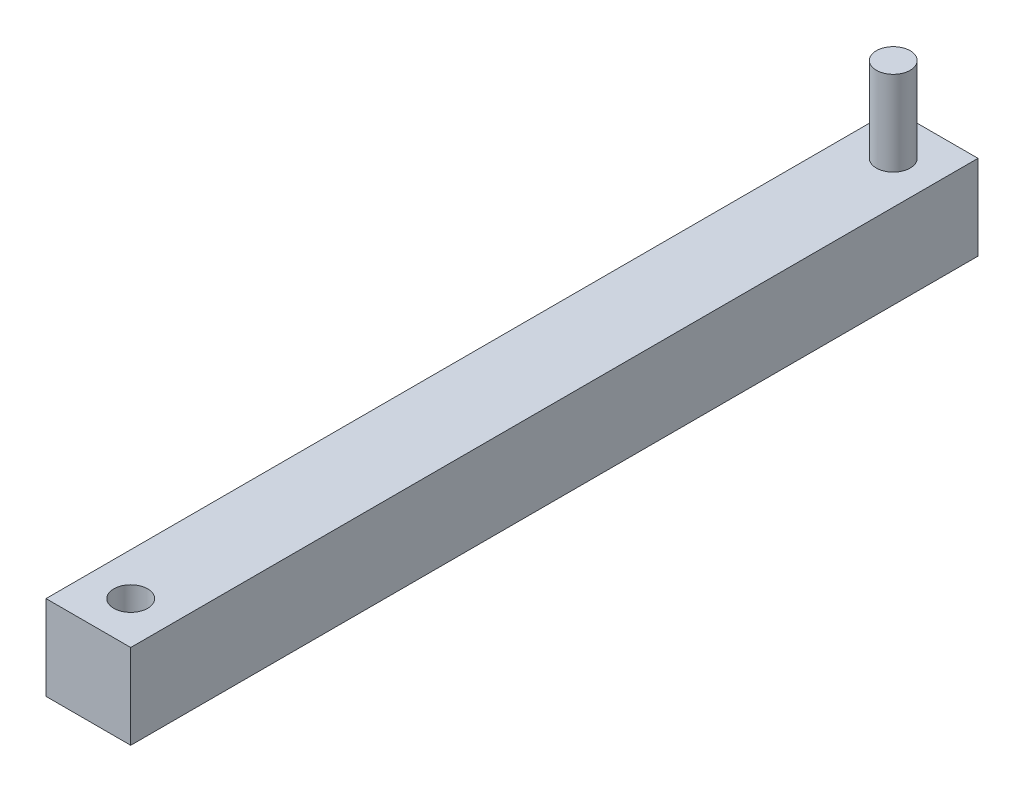
ISO-10303-21;
HEADER;
FILE_DESCRIPTION(('STEP AP214'),'2;1');
FILE_NAME('part.step','',(''),(''),'','','');
FILE_SCHEMA(('AUTOMOTIVE_DESIGN { 1 0 10303 214 1 1 1 1 }'));
ENDSEC;
DATA;
#1=APPLICATION_CONTEXT('core data for automotive mechanical design processes');
#2=APPLICATION_PROTOCOL_DEFINITION('international standard','automotive_design',2000,#1);
#3=PRODUCT_CONTEXT('',#1,'mechanical');
#4=PRODUCT('Part','Part','',(#3));
#5=PRODUCT_RELATED_PRODUCT_CATEGORY('part','',(#4));
#6=PRODUCT_DEFINITION_FORMATION('','',#4);
#7=PRODUCT_DEFINITION_CONTEXT('part definition',#1,'design');
#8=PRODUCT_DEFINITION('design','',#6,#7);
#9=PRODUCT_DEFINITION_SHAPE('','',#8);
#10=(LENGTH_UNIT() NAMED_UNIT(*) SI_UNIT(.MILLI.,.METRE.));
#11=(NAMED_UNIT(*) PLANE_ANGLE_UNIT() SI_UNIT($,.RADIAN.));
#12=(NAMED_UNIT(*) SI_UNIT($,.STERADIAN.) SOLID_ANGLE_UNIT());
#13=UNCERTAINTY_MEASURE_WITH_UNIT(LENGTH_MEASURE(1.E-05),#10,'distance_accuracy_value','');
#14=(GEOMETRIC_REPRESENTATION_CONTEXT(3) GLOBAL_UNCERTAINTY_ASSIGNED_CONTEXT((#13)) GLOBAL_UNIT_ASSIGNED_CONTEXT((#10,
#11,#12)) REPRESENTATION_CONTEXT('',''));
#15=CARTESIAN_POINT('',(0.,0.,0.));
#16=DIRECTION('',(0.,0.,1.));
#17=DIRECTION('',(1.,0.,0.));
#18=AXIS2_PLACEMENT_3D('',#15,#16,#17);
#19=CARTESIAN_POINT('',(5.,5.,100.));
#20=DIRECTION('',(-1.,0.,0.));
#21=DIRECTION('',(0.,0.,1.));
#22=AXIS2_PLACEMENT_3D('',#19,#20,#21);
#23=PLANE('',#22);
#24=DIRECTION('',(0.,1.,0.));
#25=VECTOR('',#24,1.);
#26=CARTESIAN_POINT('',(5.,5.,0.));
#27=LINE('',#26,#25);
#28=CARTESIAN_POINT('',(5.,-5.,0.));
#29=VERTEX_POINT('',#28);
#30=CARTESIAN_POINT('',(5.,5.,0.));
#31=VERTEX_POINT('',#30);
#32=EDGE_CURVE('E110',#29,#31,#27,.T.);
#33=ORIENTED_EDGE('',*,*,#32,.T.);
#34=DIRECTION('',(0.,0.,-1.));
#35=VECTOR('',#34,1.);
#36=CARTESIAN_POINT('',(5.,5.,100.));
#37=LINE('',#36,#35);
#38=CARTESIAN_POINT('',(5.,5.,100.));
#39=VERTEX_POINT('',#38);
#40=EDGE_CURVE('E48',#39,#31,#37,.T.);
#41=ORIENTED_EDGE('',*,*,#40,.F.);
#42=DIRECTION('',(0.,1.,0.));
#43=VECTOR('',#42,1.);
#44=CARTESIAN_POINT('',(5.,5.,100.));
#45=LINE('',#44,#43);
#46=CARTESIAN_POINT('',(5.,-5.,100.));
#47=VERTEX_POINT('',#46);
#48=EDGE_CURVE('E92',#47,#39,#45,.T.);
#49=ORIENTED_EDGE('',*,*,#48,.F.);
#50=DIRECTION('',(0.,0.,-1.));
#51=VECTOR('',#50,1.);
#52=CARTESIAN_POINT('',(5.,-5.,100.));
#53=LINE('',#52,#51);
#54=EDGE_CURVE('E106',#47,#29,#53,.T.);
#55=ORIENTED_EDGE('',*,*,#54,.T.);
#56=EDGE_LOOP('',(#33,#41,#49,#55));
#57=FACE_BOUND('',#56,.T.);
#58=ADVANCED_FACE('F39',(#57),#23,.F.);
#59=CARTESIAN_POINT('',(-5.,5.,100.));
#60=DIRECTION('',(0.,-1.,0.));
#61=DIRECTION('',(0.,0.,-1.));
#62=AXIS2_PLACEMENT_3D('',#59,#60,#61);
#63=PLANE('',#62);
#64=CARTESIAN_POINT('',(0.,5.,5.));
#65=DIRECTION('',(0.,-1.,0.));
#66=DIRECTION('',(0.,0.,-1.));
#67=AXIS2_PLACEMENT_3D('',#64,#65,#66);
#68=CIRCLE('',#67,2.);
#69=CARTESIAN_POINT('',(0.,5.,3.));
#70=VERTEX_POINT('',#69);
#71=EDGE_CURVE('E11',#70,#70,#68,.F.);
#72=ORIENTED_EDGE('',*,*,#71,.F.);
#73=EDGE_LOOP('',(#72));
#74=FACE_BOUND('',#73,.T.);
#75=CARTESIAN_POINT('',(0.,5.,95.));
#76=DIRECTION('',(0.,1.,0.));
#77=DIRECTION('',(0.,0.,1.));
#78=AXIS2_PLACEMENT_3D('',#75,#76,#77);
#79=CIRCLE('',#78,2.);
#80=CARTESIAN_POINT('',(0.,5.,97.));
#81=VERTEX_POINT('',#80);
#82=EDGE_CURVE('E161',#81,#81,#79,.T.);
#83=ORIENTED_EDGE('',*,*,#82,.F.);
#84=EDGE_LOOP('',(#83));
#85=FACE_BOUND('',#84,.T.);
#86=DIRECTION('',(-1.,0.,0.));
#87=VECTOR('',#86,1.);
#88=CARTESIAN_POINT('',(-5.,5.,0.));
#89=LINE('',#88,#87);
#90=CARTESIAN_POINT('',(-5.,5.,0.));
#91=VERTEX_POINT('',#90);
#92=EDGE_CURVE('E98',#31,#91,#89,.T.);
#93=ORIENTED_EDGE('',*,*,#92,.T.);
#94=DIRECTION('',(0.,0.,-1.));
#95=VECTOR('',#94,1.);
#96=CARTESIAN_POINT('',(-5.,5.,100.));
#97=LINE('',#96,#95);
#98=CARTESIAN_POINT('',(-5.,5.,100.));
#99=VERTEX_POINT('',#98);
#100=EDGE_CURVE('E96',#99,#91,#97,.T.);
#101=ORIENTED_EDGE('',*,*,#100,.F.);
#102=DIRECTION('',(-1.,0.,0.));
#103=VECTOR('',#102,1.);
#104=CARTESIAN_POINT('',(-5.,5.,100.));
#105=LINE('',#104,#103);
#106=EDGE_CURVE('E87',#39,#99,#105,.T.);
#107=ORIENTED_EDGE('',*,*,#106,.F.);
#108=ORIENTED_EDGE('',*,*,#40,.T.);
#109=EDGE_LOOP('',(#93,#101,#107,#108));
#110=FACE_BOUND('',#109,.T.);
#111=ADVANCED_FACE('F97',(#74,#85,#110),#63,.F.);
#112=CARTESIAN_POINT('',(-5.,5.,100.));
#113=DIRECTION('',(1.,0.,0.));
#114=DIRECTION('',(0.,1.,0.));
#115=AXIS2_PLACEMENT_3D('',#112,#113,#114);
#116=PLANE('',#115);
#117=DIRECTION('',(0.,-1.,0.));
#118=VECTOR('',#117,1.);
#119=CARTESIAN_POINT('',(-5.,5.,0.));
#120=LINE('',#119,#118);
#121=CARTESIAN_POINT('',(-5.,-5.,0.));
#122=VERTEX_POINT('',#121);
#123=EDGE_CURVE('E73',#91,#122,#120,.T.);
#124=ORIENTED_EDGE('',*,*,#123,.T.);
#125=DIRECTION('',(0.,0.,-1.));
#126=VECTOR('',#125,1.);
#127=CARTESIAN_POINT('',(-5.,-5.,100.));
#128=LINE('',#127,#126);
#129=CARTESIAN_POINT('',(-5.,-5.,100.));
#130=VERTEX_POINT('',#129);
#131=EDGE_CURVE('E100',#130,#122,#128,.T.);
#132=ORIENTED_EDGE('',*,*,#131,.F.);
#133=DIRECTION('',(0.,-1.,0.));
#134=VECTOR('',#133,1.);
#135=CARTESIAN_POINT('',(-5.,5.,100.));
#136=LINE('',#135,#134);
#137=EDGE_CURVE('E90',#99,#130,#136,.T.);
#138=ORIENTED_EDGE('',*,*,#137,.F.);
#139=ORIENTED_EDGE('',*,*,#100,.T.);
#140=EDGE_LOOP('',(#124,#132,#138,#139));
#141=FACE_BOUND('',#140,.T.);
#142=ADVANCED_FACE('F102',(#141),#116,.F.);
#143=CARTESIAN_POINT('',(-5.,-5.,100.));
#144=DIRECTION('',(0.,1.,0.));
#145=DIRECTION('',(0.,0.,1.));
#146=AXIS2_PLACEMENT_3D('',#143,#144,#145);
#147=PLANE('',#146);
#148=CARTESIAN_POINT('',(0.,-5.,95.));
#149=DIRECTION('',(0.,1.,0.));
#150=DIRECTION('',(0.,0.,1.));
#151=AXIS2_PLACEMENT_3D('',#148,#149,#150);
#152=CIRCLE('',#151,2.);
#153=CARTESIAN_POINT('',(0.,-5.,97.));
#154=VERTEX_POINT('',#153);
#155=EDGE_CURVE('E114',#154,#154,#152,.F.);
#156=ORIENTED_EDGE('',*,*,#155,.F.);
#157=EDGE_LOOP('',(#156));
#158=FACE_BOUND('',#157,.T.);
#159=DIRECTION('',(1.,0.,0.));
#160=VECTOR('',#159,1.);
#161=CARTESIAN_POINT('',(-5.,-5.,0.));
#162=LINE('',#161,#160);
#163=EDGE_CURVE('E79',#122,#29,#162,.T.);
#164=ORIENTED_EDGE('',*,*,#163,.T.);
#165=ORIENTED_EDGE('',*,*,#54,.F.);
#166=DIRECTION('',(1.,0.,0.));
#167=VECTOR('',#166,1.);
#168=CARTESIAN_POINT('',(-5.,-5.,100.));
#169=LINE('',#168,#167);
#170=EDGE_CURVE('E56',#130,#47,#169,.T.);
#171=ORIENTED_EDGE('',*,*,#170,.F.);
#172=ORIENTED_EDGE('',*,*,#131,.T.);
#173=EDGE_LOOP('',(#164,#165,#171,#172));
#174=FACE_BOUND('',#173,.T.);
#175=ADVANCED_FACE('F139',(#158,#174),#147,.F.);
#176=CARTESIAN_POINT('',(0.,0.,100.));
#177=DIRECTION('',(0.,0.,1.));
#178=DIRECTION('',(1.,0.,0.));
#179=AXIS2_PLACEMENT_3D('',#176,#177,#178);
#180=PLANE('',#179);
#181=ORIENTED_EDGE('',*,*,#48,.T.);
#182=ORIENTED_EDGE('',*,*,#106,.T.);
#183=ORIENTED_EDGE('',*,*,#137,.T.);
#184=ORIENTED_EDGE('',*,*,#170,.T.);
#185=EDGE_LOOP('',(#181,#182,#183,#184));
#186=FACE_BOUND('',#185,.T.);
#187=ADVANCED_FACE('F88',(#186),#180,.T.);
#188=CARTESIAN_POINT('',(0.,0.,0.));
#189=DIRECTION('',(0.,0.,1.));
#190=DIRECTION('',(1.,0.,0.));
#191=AXIS2_PLACEMENT_3D('',#188,#189,#190);
#192=PLANE('',#191);
#193=ORIENTED_EDGE('',*,*,#32,.F.);
#194=ORIENTED_EDGE('',*,*,#163,.F.);
#195=ORIENTED_EDGE('',*,*,#123,.F.);
#196=ORIENTED_EDGE('',*,*,#92,.F.);
#197=EDGE_LOOP('',(#193,#194,#195,#196));
#198=FACE_BOUND('',#197,.T.);
#199=ADVANCED_FACE('F128',(#198),#192,.F.);
#200=CARTESIAN_POINT('',(0.,-5.001,95.));
#201=DIRECTION('',(0.,1.,0.));
#202=DIRECTION('',(0.,0.,1.));
#203=AXIS2_PLACEMENT_3D('',#200,#201,#202);
#204=CYLINDRICAL_SURFACE('',#203,2.);
#205=ORIENTED_EDGE('',*,*,#82,.T.);
#206=EDGE_LOOP('',(#205));
#207=FACE_BOUND('',#206,.T.);
#208=ORIENTED_EDGE('',*,*,#155,.T.);
#209=EDGE_LOOP('',(#208));
#210=FACE_BOUND('',#209,.T.);
#211=ADVANCED_FACE('F130',(#207,#210),#204,.F.);
#212=CARTESIAN_POINT('',(0.,15.,5.));
#213=DIRECTION('',(0.,-1.,0.));
#214=DIRECTION('',(0.,0.,-1.));
#215=AXIS2_PLACEMENT_3D('',#212,#213,#214);
#216=CYLINDRICAL_SURFACE('',#215,2.);
#217=CARTESIAN_POINT('',(0.,15.,5.));
#218=DIRECTION('',(0.,1.,0.));
#219=DIRECTION('',(0.,0.,1.));
#220=AXIS2_PLACEMENT_3D('',#217,#218,#219);
#221=CIRCLE('',#220,2.);
#222=CARTESIAN_POINT('',(0.,15.,7.));
#223=VERTEX_POINT('',#222);
#224=EDGE_CURVE('E165',#223,#223,#221,.T.);
#225=ORIENTED_EDGE('',*,*,#224,.F.);
#226=EDGE_LOOP('',(#225));
#227=FACE_BOUND('',#226,.T.);
#228=ORIENTED_EDGE('',*,*,#71,.T.);
#229=EDGE_LOOP('',(#228));
#230=FACE_BOUND('',#229,.T.);
#231=ADVANCED_FACE('F136',(#227,#230),#216,.T.);
#232=CARTESIAN_POINT('',(0.,15.,5.));
#233=DIRECTION('',(0.,1.,0.));
#234=DIRECTION('',(0.,0.,1.));
#235=AXIS2_PLACEMENT_3D('',#232,#233,#234);
#236=PLANE('',#235);
#237=ORIENTED_EDGE('',*,*,#224,.T.);
#238=EDGE_LOOP('',(#237));
#239=FACE_BOUND('',#238,.T.);
#240=ADVANCED_FACE('F173',(#239),#236,.T.);
#241=CLOSED_SHELL('',(#58,#111,#142,#175,#187,#199,#211,#231,#240));
#242=MANIFOLD_SOLID_BREP('B2',#241);
#243=ADVANCED_BREP_SHAPE_REPRESENTATION('',(#18,#242),#14);
#244=SHAPE_DEFINITION_REPRESENTATION(#9,#243);
ENDSEC;
END-ISO-10303-21;
